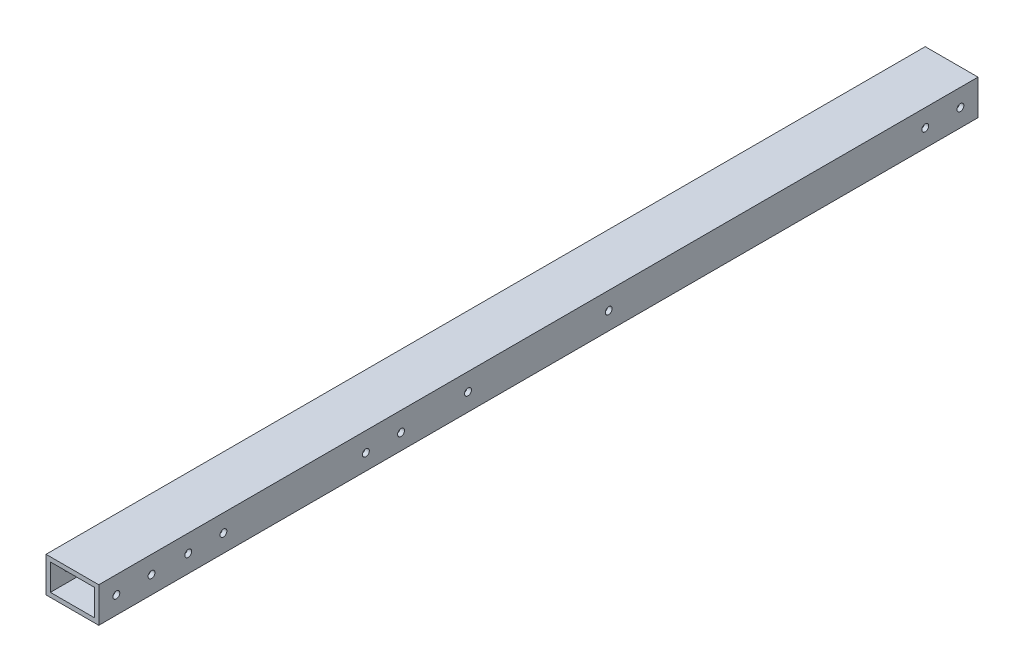
ISO-10303-21;
HEADER;
FILE_DESCRIPTION(('STEP AP214'),'2;1');
FILE_NAME('part.step','',(''),(''),'','','');
FILE_SCHEMA(('AUTOMOTIVE_DESIGN { 1 0 10303 214 1 1 1 1 }'));
ENDSEC;
DATA;
#1=APPLICATION_CONTEXT('core data for automotive mechanical design processes');
#2=APPLICATION_PROTOCOL_DEFINITION('international standard','automotive_design',2000,#1);
#3=PRODUCT_CONTEXT('',#1,'mechanical');
#4=PRODUCT('Part','Part','',(#3));
#5=PRODUCT_RELATED_PRODUCT_CATEGORY('part','',(#4));
#6=PRODUCT_DEFINITION_FORMATION('','',#4);
#7=PRODUCT_DEFINITION_CONTEXT('part definition',#1,'design');
#8=PRODUCT_DEFINITION('design','',#6,#7);
#9=PRODUCT_DEFINITION_SHAPE('','',#8);
#10=(LENGTH_UNIT() NAMED_UNIT(*) SI_UNIT(.MILLI.,.METRE.));
#11=(NAMED_UNIT(*) PLANE_ANGLE_UNIT() SI_UNIT($,.RADIAN.));
#12=(NAMED_UNIT(*) SI_UNIT($,.STERADIAN.) SOLID_ANGLE_UNIT());
#13=UNCERTAINTY_MEASURE_WITH_UNIT(LENGTH_MEASURE(1.E-05),#10,'distance_accuracy_value','');
#14=(GEOMETRIC_REPRESENTATION_CONTEXT(3) GLOBAL_UNCERTAINTY_ASSIGNED_CONTEXT((#13)) GLOBAL_UNIT_ASSIGNED_CONTEXT((#10,
#11,#12)) REPRESENTATION_CONTEXT('',''));
#15=CARTESIAN_POINT('',(0.,0.,0.));
#16=DIRECTION('',(0.,0.,1.));
#17=DIRECTION('',(1.,0.,0.));
#18=AXIS2_PLACEMENT_3D('',#15,#16,#17);
#19=CARTESIAN_POINT('',(0.,0.,317.499999492));
#20=DIRECTION('',(0.,0.,1.));
#21=DIRECTION('',(1.,0.,0.));
#22=AXIS2_PLACEMENT_3D('',#19,#20,#21);
#23=PLANE('',#22);
#24=DIRECTION('',(0.,-1.,0.));
#25=VECTOR('',#24,1.);
#26=CARTESIAN_POINT('',(-19.05,12.7,317.499999492));
#27=LINE('',#26,#25);
#28=CARTESIAN_POINT('',(-19.05,12.7,317.499999492));
#29=VERTEX_POINT('',#28);
#30=CARTESIAN_POINT('',(-19.05,-12.7,317.499999492));
#31=VERTEX_POINT('',#30);
#32=EDGE_CURVE('E121',#29,#31,#27,.T.);
#33=ORIENTED_EDGE('',*,*,#32,.T.);
#34=DIRECTION('',(1.,0.,0.));
#35=VECTOR('',#34,1.);
#36=CARTESIAN_POINT('',(-19.05,-12.7,317.499999492));
#37=LINE('',#36,#35);
#38=CARTESIAN_POINT('',(19.05,-12.7,317.499999492));
#39=VERTEX_POINT('',#38);
#40=EDGE_CURVE('E186',#31,#39,#37,.T.);
#41=ORIENTED_EDGE('',*,*,#40,.T.);
#42=DIRECTION('',(0.,1.,0.));
#43=VECTOR('',#42,1.);
#44=CARTESIAN_POINT('',(19.05,-12.7,317.499999492));
#45=LINE('',#44,#43);
#46=CARTESIAN_POINT('',(19.05,12.7,317.499999492));
#47=VERTEX_POINT('',#46);
#48=EDGE_CURVE('E189',#39,#47,#45,.T.);
#49=ORIENTED_EDGE('',*,*,#48,.T.);
#50=DIRECTION('',(-1.,0.,0.));
#51=VECTOR('',#50,1.);
#52=CARTESIAN_POINT('',(19.05,12.7,317.499999492));
#53=LINE('',#52,#51);
#54=EDGE_CURVE('E67',#47,#29,#53,.T.);
#55=ORIENTED_EDGE('',*,*,#54,.T.);
#56=EDGE_LOOP('',(#33,#41,#49,#55));
#57=FACE_BOUND('',#56,.T.);
#58=DIRECTION('',(1.,0.,0.));
#59=VECTOR('',#58,1.);
#60=CARTESIAN_POINT('',(-15.875,-9.525,317.499999492));
#61=LINE('',#60,#59);
#62=CARTESIAN_POINT('',(-15.875,-9.525,317.499999492));
#63=VERTEX_POINT('',#62);
#64=CARTESIAN_POINT('',(15.875,-9.525,317.499999492));
#65=VERTEX_POINT('',#64);
#66=EDGE_CURVE('E169',#63,#65,#61,.T.);
#67=ORIENTED_EDGE('',*,*,#66,.F.);
#68=DIRECTION('',(0.,-1.,0.));
#69=VECTOR('',#68,1.);
#70=CARTESIAN_POINT('',(-15.875,9.525,317.499999492));
#71=LINE('',#70,#69);
#72=CARTESIAN_POINT('',(-15.875,9.525,317.499999492));
#73=VERTEX_POINT('',#72);
#74=EDGE_CURVE('E117',#73,#63,#71,.T.);
#75=ORIENTED_EDGE('',*,*,#74,.F.);
#76=DIRECTION('',(-1.,0.,0.));
#77=VECTOR('',#76,1.);
#78=CARTESIAN_POINT('',(15.875,9.525,317.499999492));
#79=LINE('',#78,#77);
#80=CARTESIAN_POINT('',(15.875,9.525,317.499999492));
#81=VERTEX_POINT('',#80);
#82=EDGE_CURVE('E175',#81,#73,#79,.T.);
#83=ORIENTED_EDGE('',*,*,#82,.F.);
#84=DIRECTION('',(0.,1.,0.));
#85=VECTOR('',#84,1.);
#86=CARTESIAN_POINT('',(15.875,-9.525,317.499999492));
#87=LINE('',#86,#85);
#88=EDGE_CURVE('E172',#65,#81,#87,.T.);
#89=ORIENTED_EDGE('',*,*,#88,.F.);
#90=EDGE_LOOP('',(#67,#75,#83,#89));
#91=FACE_BOUND('',#90,.T.);
#92=ADVANCED_FACE('F41',(#57,#91),#23,.T.);
#93=CARTESIAN_POINT('',(-19.05,12.7,317.499999492));
#94=DIRECTION('',(1.,0.,0.));
#95=DIRECTION('',(0.,0.,-1.));
#96=AXIS2_PLACEMENT_3D('',#93,#94,#95);
#97=PLANE('',#96);
#98=CARTESIAN_POINT('',(-19.05,0.,-50.8));
#99=DIRECTION('',(-1.,0.,0.));
#100=DIRECTION('',(0.,0.,1.));
#101=AXIS2_PLACEMENT_3D('',#98,#99,#100);
#102=CIRCLE('',#101,2.48919999999999);
#103=CARTESIAN_POINT('',(-19.05,0.,-48.3108));
#104=VERTEX_POINT('',#103);
#105=EDGE_CURVE('E439',#104,#104,#102,.T.);
#106=ORIENTED_EDGE('',*,*,#105,.F.);
#107=EDGE_LOOP('',(#106));
#108=FACE_BOUND('',#107,.T.);
#109=CARTESIAN_POINT('',(-19.05,0.,50.8));
#110=DIRECTION('',(-1.,0.,0.));
#111=DIRECTION('',(0.,0.,1.));
#112=AXIS2_PLACEMENT_3D('',#109,#110,#111);
#113=CIRCLE('',#112,2.48919999999999);
#114=CARTESIAN_POINT('',(-19.05,0.,53.2892));
#115=VERTEX_POINT('',#114);
#116=EDGE_CURVE('E445',#115,#115,#113,.T.);
#117=ORIENTED_EDGE('',*,*,#116,.F.);
#118=EDGE_LOOP('',(#117));
#119=FACE_BOUND('',#118,.T.);
#120=CARTESIAN_POINT('',(-19.05,-1.23159570805203,124.587000508));
#121=DIRECTION('',(1.,0.,0.));
#122=DIRECTION('',(0.,0.,-1.));
#123=AXIS2_PLACEMENT_3D('',#120,#121,#122);
#124=CIRCLE('',#123,2.48919999999999);
#125=CARTESIAN_POINT('',(-19.05,-1.23159570805203,122.097800508));
#126=VERTEX_POINT('',#125);
#127=EDGE_CURVE('E458',#126,#126,#124,.T.);
#128=ORIENTED_EDGE('',*,*,#127,.T.);
#129=EDGE_LOOP('',(#128));
#130=FACE_BOUND('',#129,.T.);
#131=CARTESIAN_POINT('',(-19.05,-1.23159570805206,99.1870005080002));
#132=DIRECTION('',(1.,0.,0.));
#133=DIRECTION('',(0.,0.,-1.));
#134=AXIS2_PLACEMENT_3D('',#131,#132,#133);
#135=CIRCLE('',#134,2.48919999999999);
#136=CARTESIAN_POINT('',(-19.05,-1.23159570805206,96.6978005080002));
#137=VERTEX_POINT('',#136);
#138=EDGE_CURVE('E232',#137,#137,#135,.T.);
#139=ORIENTED_EDGE('',*,*,#138,.T.);
#140=EDGE_LOOP('',(#139));
#141=FACE_BOUND('',#140,.T.);
#142=CARTESIAN_POINT('',(-19.05,-5.03419628032631E-07,252.857000508));
#143=DIRECTION('',(1.,0.,0.));
#144=DIRECTION('',(0.,0.,-1.));
#145=AXIS2_PLACEMENT_3D('',#142,#143,#144);
#146=CIRCLE('',#145,2.48919999999999);
#147=CARTESIAN_POINT('',(-19.05,-5.03419628032631E-07,250.367800508));
#148=VERTEX_POINT('',#147);
#149=EDGE_CURVE('E228',#148,#148,#146,.T.);
#150=ORIENTED_EDGE('',*,*,#149,.T.);
#151=EDGE_LOOP('',(#150));
#152=FACE_BOUND('',#151,.T.);
#153=CARTESIAN_POINT('',(-19.05,-5.03419605056415E-07,227.457000508));
#154=DIRECTION('',(1.,0.,0.));
#155=DIRECTION('',(0.,0.,-1.));
#156=AXIS2_PLACEMENT_3D('',#153,#154,#155);
#157=CIRCLE('',#156,2.48919999999999);
#158=CARTESIAN_POINT('',(-19.05,-5.03419605056415E-07,224.967800508));
#159=VERTEX_POINT('',#158);
#160=EDGE_CURVE('E224',#159,#159,#157,.T.);
#161=ORIENTED_EDGE('',*,*,#160,.T.);
#162=EDGE_LOOP('',(#161));
#163=FACE_BOUND('',#162,.T.);
#164=CARTESIAN_POINT('',(-19.05,0.,-304.799999492));
#165=DIRECTION('',(-1.,0.,0.));
#166=DIRECTION('',(0.,0.,1.));
#167=AXIS2_PLACEMENT_3D('',#164,#165,#166);
#168=CIRCLE('',#167,2.4892);
#169=CARTESIAN_POINT('',(-19.05,0.,-302.310799492));
#170=VERTEX_POINT('',#169);
#171=EDGE_CURVE('E261',#170,#170,#168,.T.);
#172=ORIENTED_EDGE('',*,*,#171,.F.);
#173=EDGE_LOOP('',(#172));
#174=FACE_BOUND('',#173,.T.);
#175=CARTESIAN_POINT('',(-19.05,0.,-279.399999492));
#176=DIRECTION('',(-1.,0.,0.));
#177=DIRECTION('',(0.,0.,1.));
#178=AXIS2_PLACEMENT_3D('',#175,#176,#177);
#179=CIRCLE('',#178,2.4892);
#180=CARTESIAN_POINT('',(-19.05,0.,-276.910799492));
#181=VERTEX_POINT('',#180);
#182=EDGE_CURVE('E268',#181,#181,#179,.T.);
#183=ORIENTED_EDGE('',*,*,#182,.F.);
#184=EDGE_LOOP('',(#183));
#185=FACE_BOUND('',#184,.T.);
#186=CARTESIAN_POINT('',(-19.05,0.,279.400000508));
#187=DIRECTION('',(-1.,0.,0.));
#188=DIRECTION('',(0.,0.,1.));
#189=AXIS2_PLACEMENT_3D('',#186,#187,#188);
#190=CIRCLE('',#189,2.4892);
#191=CARTESIAN_POINT('',(-19.05,0.,281.889200508));
#192=VERTEX_POINT('',#191);
#193=EDGE_CURVE('E275',#192,#192,#190,.T.);
#194=ORIENTED_EDGE('',*,*,#193,.F.);
#195=EDGE_LOOP('',(#194));
#196=FACE_BOUND('',#195,.T.);
#197=CARTESIAN_POINT('',(-19.05,0.,304.800000508));
#198=DIRECTION('',(-1.,0.,0.));
#199=DIRECTION('',(0.,0.,1.));
#200=AXIS2_PLACEMENT_3D('',#197,#198,#199);
#201=CIRCLE('',#200,2.4892);
#202=CARTESIAN_POINT('',(-19.05,0.,307.289200508));
#203=VERTEX_POINT('',#202);
#204=EDGE_CURVE('E282',#203,#203,#201,.T.);
#205=ORIENTED_EDGE('',*,*,#204,.F.);
#206=EDGE_LOOP('',(#205));
#207=FACE_BOUND('',#206,.T.);
#208=DIRECTION('',(0.,0.,-1.));
#209=VECTOR('',#208,1.);
#210=CARTESIAN_POINT('',(-19.05,12.7,317.499999492));
#211=LINE('',#210,#209);
#212=CARTESIAN_POINT('',(-19.05,12.7,-317.499999492));
#213=VERTEX_POINT('',#212);
#214=EDGE_CURVE('E194',#29,#213,#211,.T.);
#215=ORIENTED_EDGE('',*,*,#214,.T.);
#216=DIRECTION('',(0.,-1.,0.));
#217=VECTOR('',#216,1.);
#218=CARTESIAN_POINT('',(-19.05,12.7,-317.499999492));
#219=LINE('',#218,#217);
#220=CARTESIAN_POINT('',(-19.05,-12.7,-317.499999492));
#221=VERTEX_POINT('',#220);
#222=EDGE_CURVE('E151',#213,#221,#219,.T.);
#223=ORIENTED_EDGE('',*,*,#222,.T.);
#224=DIRECTION('',(0.,0.,-1.));
#225=VECTOR('',#224,1.);
#226=CARTESIAN_POINT('',(-19.05,-12.7,317.499999492));
#227=LINE('',#226,#225);
#228=EDGE_CURVE('E11',#31,#221,#227,.T.);
#229=ORIENTED_EDGE('',*,*,#228,.F.);
#230=ORIENTED_EDGE('',*,*,#32,.F.);
#231=EDGE_LOOP('',(#215,#223,#229,#230));
#232=FACE_BOUND('',#231,.T.);
#233=ADVANCED_FACE('F43',(#108,#119,#130,#141,#152,#163,#174,#185,#196,#207,#232),#97,.F.);
#234=CARTESIAN_POINT('',(-19.05,-12.7,317.499999492));
#235=DIRECTION('',(0.,1.,0.));
#236=DIRECTION('',(0.,0.,1.));
#237=AXIS2_PLACEMENT_3D('',#234,#235,#236);
#238=PLANE('',#237);
#239=ORIENTED_EDGE('',*,*,#228,.T.);
#240=DIRECTION('',(1.,0.,0.));
#241=VECTOR('',#240,1.);
#242=CARTESIAN_POINT('',(-19.05,-12.7,-317.499999492));
#243=LINE('',#242,#241);
#244=CARTESIAN_POINT('',(19.05,-12.7,-317.499999492));
#245=VERTEX_POINT('',#244);
#246=EDGE_CURVE('E155',#221,#245,#243,.T.);
#247=ORIENTED_EDGE('',*,*,#246,.T.);
#248=DIRECTION('',(0.,0.,-1.));
#249=VECTOR('',#248,1.);
#250=CARTESIAN_POINT('',(19.05,-12.7,317.499999492));
#251=LINE('',#250,#249);
#252=EDGE_CURVE('E51',#39,#245,#251,.T.);
#253=ORIENTED_EDGE('',*,*,#252,.F.);
#254=ORIENTED_EDGE('',*,*,#40,.F.);
#255=EDGE_LOOP('',(#239,#247,#253,#254));
#256=FACE_BOUND('',#255,.T.);
#257=ADVANCED_FACE('F310',(#256),#238,.F.);
#258=CARTESIAN_POINT('',(19.05,-12.7,317.499999492));
#259=DIRECTION('',(-1.,0.,0.));
#260=DIRECTION('',(0.,-1.,0.));
#261=AXIS2_PLACEMENT_3D('',#258,#259,#260);
#262=PLANE('',#261);
#263=CARTESIAN_POINT('',(19.05,0.,-50.8));
#264=DIRECTION('',(-1.,0.,0.));
#265=DIRECTION('',(0.,0.,1.));
#266=AXIS2_PLACEMENT_3D('',#263,#264,#265);
#267=CIRCLE('',#266,2.4892);
#268=CARTESIAN_POINT('',(19.05,0.,-48.3108));
#269=VERTEX_POINT('',#268);
#270=EDGE_CURVE('E438',#269,#269,#267,.T.);
#271=ORIENTED_EDGE('',*,*,#270,.T.);
#272=EDGE_LOOP('',(#271));
#273=FACE_BOUND('',#272,.T.);
#274=CARTESIAN_POINT('',(19.05,0.,50.8));
#275=DIRECTION('',(-1.,0.,0.));
#276=DIRECTION('',(0.,0.,1.));
#277=AXIS2_PLACEMENT_3D('',#274,#275,#276);
#278=CIRCLE('',#277,2.4892);
#279=CARTESIAN_POINT('',(19.05,0.,53.2892));
#280=VERTEX_POINT('',#279);
#281=EDGE_CURVE('E448',#280,#280,#278,.T.);
#282=ORIENTED_EDGE('',*,*,#281,.T.);
#283=EDGE_LOOP('',(#282));
#284=FACE_BOUND('',#283,.T.);
#285=CARTESIAN_POINT('',(19.05,-1.23159570805203,124.587000508));
#286=DIRECTION('',(1.,0.,0.));
#287=DIRECTION('',(0.,0.,-1.));
#288=AXIS2_PLACEMENT_3D('',#285,#286,#287);
#289=CIRCLE('',#288,2.4892);
#290=CARTESIAN_POINT('',(19.05,-1.23159570805203,122.097800508));
#291=VERTEX_POINT('',#290);
#292=EDGE_CURVE('E455',#291,#291,#289,.T.);
#293=ORIENTED_EDGE('',*,*,#292,.F.);
#294=EDGE_LOOP('',(#293));
#295=FACE_BOUND('',#294,.T.);
#296=CARTESIAN_POINT('',(19.05,-1.23159570805206,99.1870005080002));
#297=DIRECTION('',(1.,0.,0.));
#298=DIRECTION('',(0.,0.,-1.));
#299=AXIS2_PLACEMENT_3D('',#296,#297,#298);
#300=CIRCLE('',#299,2.4892);
#301=CARTESIAN_POINT('',(19.05,-1.23159570805206,96.6978005080002));
#302=VERTEX_POINT('',#301);
#303=EDGE_CURVE('E239',#302,#302,#300,.T.);
#304=ORIENTED_EDGE('',*,*,#303,.F.);
#305=EDGE_LOOP('',(#304));
#306=FACE_BOUND('',#305,.T.);
#307=CARTESIAN_POINT('',(19.05,-5.03419628032631E-07,252.857000508));
#308=DIRECTION('',(1.,0.,0.));
#309=DIRECTION('',(0.,0.,-1.));
#310=AXIS2_PLACEMENT_3D('',#307,#308,#309);
#311=CIRCLE('',#310,2.4892);
#312=CARTESIAN_POINT('',(19.05,-5.03419628032631E-07,250.367800508));
#313=VERTEX_POINT('',#312);
#314=EDGE_CURVE('E236',#313,#313,#311,.T.);
#315=ORIENTED_EDGE('',*,*,#314,.F.);
#316=EDGE_LOOP('',(#315));
#317=FACE_BOUND('',#316,.T.);
#318=CARTESIAN_POINT('',(19.05,-5.03419605056415E-07,227.457000508));
#319=DIRECTION('',(1.,0.,0.));
#320=DIRECTION('',(0.,0.,-1.));
#321=AXIS2_PLACEMENT_3D('',#318,#319,#320);
#322=CIRCLE('',#321,2.4892);
#323=CARTESIAN_POINT('',(19.05,-5.03419605056415E-07,224.967800508));
#324=VERTEX_POINT('',#323);
#325=EDGE_CURVE('E254',#324,#324,#322,.T.);
#326=ORIENTED_EDGE('',*,*,#325,.F.);
#327=EDGE_LOOP('',(#326));
#328=FACE_BOUND('',#327,.T.);
#329=CARTESIAN_POINT('',(19.05,0.,-304.799999492));
#330=DIRECTION('',(-1.,0.,0.));
#331=DIRECTION('',(0.,0.,1.));
#332=AXIS2_PLACEMENT_3D('',#329,#330,#331);
#333=CIRCLE('',#332,2.48919999999999);
#334=CARTESIAN_POINT('',(19.05,0.,-302.310799492));
#335=VERTEX_POINT('',#334);
#336=EDGE_CURVE('E219',#335,#335,#333,.T.);
#337=ORIENTED_EDGE('',*,*,#336,.T.);
#338=EDGE_LOOP('',(#337));
#339=FACE_BOUND('',#338,.T.);
#340=CARTESIAN_POINT('',(19.05,0.,-279.399999492));
#341=DIRECTION('',(-1.,0.,0.));
#342=DIRECTION('',(0.,0.,1.));
#343=AXIS2_PLACEMENT_3D('',#340,#341,#342);
#344=CIRCLE('',#343,2.48919999999999);
#345=CARTESIAN_POINT('',(19.05,0.,-276.910799492));
#346=VERTEX_POINT('',#345);
#347=EDGE_CURVE('E214',#346,#346,#344,.T.);
#348=ORIENTED_EDGE('',*,*,#347,.T.);
#349=EDGE_LOOP('',(#348));
#350=FACE_BOUND('',#349,.T.);
#351=CARTESIAN_POINT('',(19.05,0.,279.400000508));
#352=DIRECTION('',(-1.,0.,0.));
#353=DIRECTION('',(0.,0.,1.));
#354=AXIS2_PLACEMENT_3D('',#351,#352,#353);
#355=CIRCLE('',#354,2.48919999999999);
#356=CARTESIAN_POINT('',(19.05,0.,281.889200508));
#357=VERTEX_POINT('',#356);
#358=EDGE_CURVE('E209',#357,#357,#355,.T.);
#359=ORIENTED_EDGE('',*,*,#358,.T.);
#360=EDGE_LOOP('',(#359));
#361=FACE_BOUND('',#360,.T.);
#362=CARTESIAN_POINT('',(19.05,0.,304.800000508));
#363=DIRECTION('',(-1.,0.,0.));
#364=DIRECTION('',(0.,0.,1.));
#365=AXIS2_PLACEMENT_3D('',#362,#363,#364);
#366=CIRCLE('',#365,2.48919999999999);
#367=CARTESIAN_POINT('',(19.05,0.,307.289200508));
#368=VERTEX_POINT('',#367);
#369=EDGE_CURVE('E204',#368,#368,#366,.T.);
#370=ORIENTED_EDGE('',*,*,#369,.T.);
#371=EDGE_LOOP('',(#370));
#372=FACE_BOUND('',#371,.T.);
#373=ORIENTED_EDGE('',*,*,#252,.T.);
#374=DIRECTION('',(0.,1.,0.));
#375=VECTOR('',#374,1.);
#376=CARTESIAN_POINT('',(19.05,-12.7,-317.499999492));
#377=LINE('',#376,#375);
#378=CARTESIAN_POINT('',(19.05,12.7,-317.499999492));
#379=VERTEX_POINT('',#378);
#380=EDGE_CURVE('E159',#245,#379,#377,.T.);
#381=ORIENTED_EDGE('',*,*,#380,.T.);
#382=DIRECTION('',(0.,0.,-1.));
#383=VECTOR('',#382,1.);
#384=CARTESIAN_POINT('',(19.05,12.7,317.499999492));
#385=LINE('',#384,#383);
#386=EDGE_CURVE('E197',#47,#379,#385,.T.);
#387=ORIENTED_EDGE('',*,*,#386,.F.);
#388=ORIENTED_EDGE('',*,*,#48,.F.);
#389=EDGE_LOOP('',(#373,#381,#387,#388));
#390=FACE_BOUND('',#389,.T.);
#391=ADVANCED_FACE('F287',(#273,#284,#295,#306,#317,#328,#339,#350,#361,#372,#390),#262,.F.);
#392=CARTESIAN_POINT('',(19.05,12.7,317.499999492));
#393=DIRECTION('',(0.,-1.,0.));
#394=DIRECTION('',(0.,0.,-1.));
#395=AXIS2_PLACEMENT_3D('',#392,#393,#394);
#396=PLANE('',#395);
#397=ORIENTED_EDGE('',*,*,#386,.T.);
#398=DIRECTION('',(-1.,0.,0.));
#399=VECTOR('',#398,1.);
#400=CARTESIAN_POINT('',(19.05,12.7,-317.499999492));
#401=LINE('',#400,#399);
#402=EDGE_CURVE('E163',#379,#213,#401,.T.);
#403=ORIENTED_EDGE('',*,*,#402,.T.);
#404=ORIENTED_EDGE('',*,*,#214,.F.);
#405=ORIENTED_EDGE('',*,*,#54,.F.);
#406=EDGE_LOOP('',(#397,#403,#404,#405));
#407=FACE_BOUND('',#406,.T.);
#408=ADVANCED_FACE('F316',(#407),#396,.F.);
#409=CARTESIAN_POINT('',(-15.875,9.525,317.499999492));
#410=DIRECTION('',(1.,0.,0.));
#411=DIRECTION('',(0.,1.,0.));
#412=AXIS2_PLACEMENT_3D('',#409,#410,#411);
#413=PLANE('',#412);
#414=CARTESIAN_POINT('',(-15.875,0.,-50.8));
#415=DIRECTION('',(1.,0.,0.));
#416=DIRECTION('',(0.,1.,0.));
#417=AXIS2_PLACEMENT_3D('',#414,#415,#416);
#418=CIRCLE('',#417,2.48919999999999);
#419=CARTESIAN_POINT('',(-15.875,2.48919999999999,-50.8));
#420=VERTEX_POINT('',#419);
#421=EDGE_CURVE('E356',#420,#420,#418,.T.);
#422=ORIENTED_EDGE('',*,*,#421,.F.);
#423=EDGE_LOOP('',(#422));
#424=FACE_BOUND('',#423,.T.);
#425=CARTESIAN_POINT('',(-15.875,0.,50.8));
#426=DIRECTION('',(1.,0.,0.));
#427=DIRECTION('',(0.,1.,0.));
#428=AXIS2_PLACEMENT_3D('',#425,#426,#427);
#429=CIRCLE('',#428,2.48919999999999);
#430=CARTESIAN_POINT('',(-15.875,2.48919999999999,50.8));
#431=VERTEX_POINT('',#430);
#432=EDGE_CURVE('E360',#431,#431,#429,.T.);
#433=ORIENTED_EDGE('',*,*,#432,.F.);
#434=EDGE_LOOP('',(#433));
#435=FACE_BOUND('',#434,.T.);
#436=CARTESIAN_POINT('',(-15.875,-1.23159570805203,124.587000508));
#437=DIRECTION('',(1.,0.,0.));
#438=DIRECTION('',(0.,1.,0.));
#439=AXIS2_PLACEMENT_3D('',#436,#437,#438);
#440=CIRCLE('',#439,2.48919999999999);
#441=CARTESIAN_POINT('',(-15.875,1.25760429194796,124.587000508));
#442=VERTEX_POINT('',#441);
#443=EDGE_CURVE('E364',#442,#442,#440,.T.);
#444=ORIENTED_EDGE('',*,*,#443,.F.);
#445=EDGE_LOOP('',(#444));
#446=FACE_BOUND('',#445,.T.);
#447=CARTESIAN_POINT('',(-15.875,-1.23159570805206,99.1870005080002));
#448=DIRECTION('',(1.,0.,0.));
#449=DIRECTION('',(0.,1.,0.));
#450=AXIS2_PLACEMENT_3D('',#447,#448,#449);
#451=CIRCLE('',#450,2.48919999999999);
#452=CARTESIAN_POINT('',(-15.875,1.25760429194793,99.1870005080002));
#453=VERTEX_POINT('',#452);
#454=EDGE_CURVE('E231',#453,#453,#451,.T.);
#455=ORIENTED_EDGE('',*,*,#454,.F.);
#456=EDGE_LOOP('',(#455));
#457=FACE_BOUND('',#456,.T.);
#458=CARTESIAN_POINT('',(-15.875,-5.03419628032631E-07,252.857000508));
#459=DIRECTION('',(1.,0.,0.));
#460=DIRECTION('',(0.,1.,0.));
#461=AXIS2_PLACEMENT_3D('',#458,#459,#460);
#462=CIRCLE('',#461,2.48919999999999);
#463=CARTESIAN_POINT('',(-15.875,2.48919949658037,252.857000508));
#464=VERTEX_POINT('',#463);
#465=EDGE_CURVE('E225',#464,#464,#462,.T.);
#466=ORIENTED_EDGE('',*,*,#465,.F.);
#467=EDGE_LOOP('',(#466));
#468=FACE_BOUND('',#467,.T.);
#469=CARTESIAN_POINT('',(-15.875,-5.03419605056415E-07,227.457000508));
#470=DIRECTION('',(1.,0.,0.));
#471=DIRECTION('',(0.,1.,0.));
#472=AXIS2_PLACEMENT_3D('',#469,#470,#471);
#473=CIRCLE('',#472,2.48919999999999);
#474=CARTESIAN_POINT('',(-15.875,2.48919949658039,227.457000508));
#475=VERTEX_POINT('',#474);
#476=EDGE_CURVE('E220',#475,#475,#473,.T.);
#477=ORIENTED_EDGE('',*,*,#476,.F.);
#478=EDGE_LOOP('',(#477));
#479=FACE_BOUND('',#478,.T.);
#480=CARTESIAN_POINT('',(-15.875,0.,-304.799999492));
#481=DIRECTION('',(1.,0.,0.));
#482=DIRECTION('',(0.,1.,0.));
#483=AXIS2_PLACEMENT_3D('',#480,#481,#482);
#484=CIRCLE('',#483,2.48919999999999);
#485=CARTESIAN_POINT('',(-15.875,2.48919999999999,-304.799999492));
#486=VERTEX_POINT('',#485);
#487=EDGE_CURVE('E218',#486,#486,#484,.T.);
#488=ORIENTED_EDGE('',*,*,#487,.F.);
#489=EDGE_LOOP('',(#488));
#490=FACE_BOUND('',#489,.T.);
#491=CARTESIAN_POINT('',(-15.875,0.,-279.399999492));
#492=DIRECTION('',(1.,0.,0.));
#493=DIRECTION('',(0.,1.,0.));
#494=AXIS2_PLACEMENT_3D('',#491,#492,#493);
#495=CIRCLE('',#494,2.48919999999999);
#496=CARTESIAN_POINT('',(-15.875,2.48919999999992,-279.399999492));
#497=VERTEX_POINT('',#496);
#498=EDGE_CURVE('E213',#497,#497,#495,.T.);
#499=ORIENTED_EDGE('',*,*,#498,.F.);
#500=EDGE_LOOP('',(#499));
#501=FACE_BOUND('',#500,.T.);
#502=CARTESIAN_POINT('',(-15.875,0.,279.400000508));
#503=DIRECTION('',(1.,0.,0.));
#504=DIRECTION('',(0.,1.,0.));
#505=AXIS2_PLACEMENT_3D('',#502,#503,#504);
#506=CIRCLE('',#505,2.48919999999999);
#507=CARTESIAN_POINT('',(-15.875,2.48919999999999,279.400000508));
#508=VERTEX_POINT('',#507);
#509=EDGE_CURVE('E208',#508,#508,#506,.T.);
#510=ORIENTED_EDGE('',*,*,#509,.F.);
#511=EDGE_LOOP('',(#510));
#512=FACE_BOUND('',#511,.T.);
#513=CARTESIAN_POINT('',(-15.875,0.,304.800000508));
#514=DIRECTION('',(1.,0.,0.));
#515=DIRECTION('',(0.,1.,0.));
#516=AXIS2_PLACEMENT_3D('',#513,#514,#515);
#517=CIRCLE('',#516,2.48919999999999);
#518=CARTESIAN_POINT('',(-15.875,2.48919999999999,304.800000508));
#519=VERTEX_POINT('',#518);
#520=EDGE_CURVE('E143',#519,#519,#517,.T.);
#521=ORIENTED_EDGE('',*,*,#520,.F.);
#522=EDGE_LOOP('',(#521));
#523=FACE_BOUND('',#522,.T.);
#524=DIRECTION('',(0.,0.,-1.));
#525=VECTOR('',#524,1.);
#526=CARTESIAN_POINT('',(-15.875,-9.525,317.499999492));
#527=LINE('',#526,#525);
#528=CARTESIAN_POINT('',(-15.875,-9.525,-317.499999492));
#529=VERTEX_POINT('',#528);
#530=EDGE_CURVE('E109',#63,#529,#527,.T.);
#531=ORIENTED_EDGE('',*,*,#530,.T.);
#532=DIRECTION('',(0.,-1.,0.));
#533=VECTOR('',#532,1.);
#534=CARTESIAN_POINT('',(-15.875,9.525,-317.499999492));
#535=LINE('',#534,#533);
#536=CARTESIAN_POINT('',(-15.875,9.525,-317.499999492));
#537=VERTEX_POINT('',#536);
#538=EDGE_CURVE('E114',#537,#529,#535,.T.);
#539=ORIENTED_EDGE('',*,*,#538,.F.);
#540=DIRECTION('',(0.,0.,-1.));
#541=VECTOR('',#540,1.);
#542=CARTESIAN_POINT('',(-15.875,9.525,317.499999492));
#543=LINE('',#542,#541);
#544=EDGE_CURVE('E178',#73,#537,#543,.T.);
#545=ORIENTED_EDGE('',*,*,#544,.F.);
#546=ORIENTED_EDGE('',*,*,#74,.T.);
#547=EDGE_LOOP('',(#531,#539,#545,#546));
#548=FACE_BOUND('',#547,.T.);
#549=ADVANCED_FACE('F111',(#424,#435,#446,#457,#468,#479,#490,#501,#512,#523,#548),#413,.T.);
#550=CARTESIAN_POINT('',(-15.875,-9.525,317.499999492));
#551=DIRECTION('',(0.,1.,0.));
#552=DIRECTION('',(0.,0.,1.));
#553=AXIS2_PLACEMENT_3D('',#550,#551,#552);
#554=PLANE('',#553);
#555=DIRECTION('',(0.,0.,-1.));
#556=VECTOR('',#555,1.);
#557=CARTESIAN_POINT('',(15.875,-9.525,317.499999492));
#558=LINE('',#557,#556);
#559=CARTESIAN_POINT('',(15.875,-9.525,-317.499999492));
#560=VERTEX_POINT('',#559);
#561=EDGE_CURVE('E122',#65,#560,#558,.T.);
#562=ORIENTED_EDGE('',*,*,#561,.T.);
#563=DIRECTION('',(1.,0.,0.));
#564=VECTOR('',#563,1.);
#565=CARTESIAN_POINT('',(-15.875,-9.525,-317.499999492));
#566=LINE('',#565,#564);
#567=EDGE_CURVE('E125',#529,#560,#566,.T.);
#568=ORIENTED_EDGE('',*,*,#567,.F.);
#569=ORIENTED_EDGE('',*,*,#530,.F.);
#570=ORIENTED_EDGE('',*,*,#66,.T.);
#571=EDGE_LOOP('',(#562,#568,#569,#570));
#572=FACE_BOUND('',#571,.T.);
#573=ADVANCED_FACE('F126',(#572),#554,.T.);
#574=CARTESIAN_POINT('',(15.875,-9.525,317.499999492));
#575=DIRECTION('',(-1.,0.,0.));
#576=DIRECTION('',(0.,-1.,0.));
#577=AXIS2_PLACEMENT_3D('',#574,#575,#576);
#578=PLANE('',#577);
#579=CARTESIAN_POINT('',(15.875,0.,-50.8));
#580=DIRECTION('',(-1.,0.,0.));
#581=DIRECTION('',(0.,-1.,0.));
#582=AXIS2_PLACEMENT_3D('',#579,#580,#581);
#583=CIRCLE('',#582,2.48919999999999);
#584=CARTESIAN_POINT('',(15.875,-2.4892,-50.8));
#585=VERTEX_POINT('',#584);
#586=EDGE_CURVE('E45',#585,#585,#583,.T.);
#587=ORIENTED_EDGE('',*,*,#586,.F.);
#588=EDGE_LOOP('',(#587));
#589=FACE_BOUND('',#588,.T.);
#590=CARTESIAN_POINT('',(15.875,0.,50.8));
#591=DIRECTION('',(-1.,0.,0.));
#592=DIRECTION('',(0.,-1.,0.));
#593=AXIS2_PLACEMENT_3D('',#590,#591,#592);
#594=CIRCLE('',#593,2.48919999999999);
#595=CARTESIAN_POINT('',(15.875,-2.48919999999999,50.8));
#596=VERTEX_POINT('',#595);
#597=EDGE_CURVE('E452',#596,#596,#594,.T.);
#598=ORIENTED_EDGE('',*,*,#597,.F.);
#599=EDGE_LOOP('',(#598));
#600=FACE_BOUND('',#599,.T.);
#601=CARTESIAN_POINT('',(15.875,-1.23159570805203,124.587000508));
#602=DIRECTION('',(-1.,0.,0.));
#603=DIRECTION('',(0.,-1.,0.));
#604=AXIS2_PLACEMENT_3D('',#601,#602,#603);
#605=CIRCLE('',#604,2.48919999999999);
#606=CARTESIAN_POINT('',(15.875,-3.72079570805203,124.587000508));
#607=VERTEX_POINT('',#606);
#608=EDGE_CURVE('E244',#607,#607,#605,.T.);
#609=ORIENTED_EDGE('',*,*,#608,.F.);
#610=EDGE_LOOP('',(#609));
#611=FACE_BOUND('',#610,.T.);
#612=CARTESIAN_POINT('',(15.875,-1.23159570805206,99.1870005080002));
#613=DIRECTION('',(-1.,0.,0.));
#614=DIRECTION('',(0.,-1.,0.));
#615=AXIS2_PLACEMENT_3D('',#612,#613,#614);
#616=CIRCLE('',#615,2.48919999999999);
#617=CARTESIAN_POINT('',(15.875,-3.72079570805205,99.1870005080002));
#618=VERTEX_POINT('',#617);
#619=EDGE_CURVE('E229',#618,#618,#616,.T.);
#620=ORIENTED_EDGE('',*,*,#619,.F.);
#621=EDGE_LOOP('',(#620));
#622=FACE_BOUND('',#621,.T.);
#623=CARTESIAN_POINT('',(15.875,-5.03419628032631E-07,252.857000508));
#624=DIRECTION('',(-1.,0.,0.));
#625=DIRECTION('',(0.,-1.,0.));
#626=AXIS2_PLACEMENT_3D('',#623,#624,#625);
#627=CIRCLE('',#626,2.48919999999999);
#628=CARTESIAN_POINT('',(15.875,-2.48920050341962,252.857000508));
#629=VERTEX_POINT('',#628);
#630=EDGE_CURVE('E227',#629,#629,#627,.T.);
#631=ORIENTED_EDGE('',*,*,#630,.F.);
#632=EDGE_LOOP('',(#631));
#633=FACE_BOUND('',#632,.T.);
#634=CARTESIAN_POINT('',(15.875,-5.03419605056415E-07,227.457000508));
#635=DIRECTION('',(-1.,0.,0.));
#636=DIRECTION('',(0.,-1.,0.));
#637=AXIS2_PLACEMENT_3D('',#634,#635,#636);
#638=CIRCLE('',#637,2.48919999999999);
#639=CARTESIAN_POINT('',(15.875,-2.4892005034196,227.457000508));
#640=VERTEX_POINT('',#639);
#641=EDGE_CURVE('E223',#640,#640,#638,.T.);
#642=ORIENTED_EDGE('',*,*,#641,.F.);
#643=EDGE_LOOP('',(#642));
#644=FACE_BOUND('',#643,.T.);
#645=CARTESIAN_POINT('',(15.875,0.,-304.799999492));
#646=DIRECTION('',(-1.,0.,0.));
#647=DIRECTION('',(0.,-1.,0.));
#648=AXIS2_PLACEMENT_3D('',#645,#646,#647);
#649=CIRCLE('',#648,2.48919999999999);
#650=CARTESIAN_POINT('',(15.875,-2.48919999999999,-304.799999492));
#651=VERTEX_POINT('',#650);
#652=EDGE_CURVE('E215',#651,#651,#649,.T.);
#653=ORIENTED_EDGE('',*,*,#652,.F.);
#654=EDGE_LOOP('',(#653));
#655=FACE_BOUND('',#654,.T.);
#656=CARTESIAN_POINT('',(15.875,0.,-279.399999492));
#657=DIRECTION('',(-1.,0.,0.));
#658=DIRECTION('',(0.,-1.,0.));
#659=AXIS2_PLACEMENT_3D('',#656,#657,#658);
#660=CIRCLE('',#659,2.48919999999999);
#661=CARTESIAN_POINT('',(15.875,-2.48920000000007,-279.399999492));
#662=VERTEX_POINT('',#661);
#663=EDGE_CURVE('E210',#662,#662,#660,.T.);
#664=ORIENTED_EDGE('',*,*,#663,.F.);
#665=EDGE_LOOP('',(#664));
#666=FACE_BOUND('',#665,.T.);
#667=CARTESIAN_POINT('',(15.875,0.,279.400000508));
#668=DIRECTION('',(-1.,0.,0.));
#669=DIRECTION('',(0.,-1.,0.));
#670=AXIS2_PLACEMENT_3D('',#667,#668,#669);
#671=CIRCLE('',#670,2.48919999999999);
#672=CARTESIAN_POINT('',(15.875,-2.4892,279.400000508));
#673=VERTEX_POINT('',#672);
#674=EDGE_CURVE('E205',#673,#673,#671,.T.);
#675=ORIENTED_EDGE('',*,*,#674,.F.);
#676=EDGE_LOOP('',(#675));
#677=FACE_BOUND('',#676,.T.);
#678=CARTESIAN_POINT('',(15.875,0.,304.800000508));
#679=DIRECTION('',(-1.,0.,0.));
#680=DIRECTION('',(0.,-1.,0.));
#681=AXIS2_PLACEMENT_3D('',#678,#679,#680);
#682=CIRCLE('',#681,2.48919999999999);
#683=CARTESIAN_POINT('',(15.875,-2.48919999999999,304.800000508));
#684=VERTEX_POINT('',#683);
#685=EDGE_CURVE('E138',#684,#684,#682,.T.);
#686=ORIENTED_EDGE('',*,*,#685,.F.);
#687=EDGE_LOOP('',(#686));
#688=FACE_BOUND('',#687,.T.);
#689=DIRECTION('',(0.,0.,-1.));
#690=VECTOR('',#689,1.);
#691=CARTESIAN_POINT('',(15.875,9.525,317.499999492));
#692=LINE('',#691,#690);
#693=CARTESIAN_POINT('',(15.875,9.525,-317.499999492));
#694=VERTEX_POINT('',#693);
#695=EDGE_CURVE('E59',#81,#694,#692,.T.);
#696=ORIENTED_EDGE('',*,*,#695,.T.);
#697=DIRECTION('',(0.,1.,0.));
#698=VECTOR('',#697,1.);
#699=CARTESIAN_POINT('',(15.875,-9.525,-317.499999492));
#700=LINE('',#699,#698);
#701=EDGE_CURVE('E132',#560,#694,#700,.T.);
#702=ORIENTED_EDGE('',*,*,#701,.F.);
#703=ORIENTED_EDGE('',*,*,#561,.F.);
#704=ORIENTED_EDGE('',*,*,#88,.T.);
#705=EDGE_LOOP('',(#696,#702,#703,#704));
#706=FACE_BOUND('',#705,.T.);
#707=ADVANCED_FACE('F341',(#589,#600,#611,#622,#633,#644,#655,#666,#677,#688,#706),#578,.T.);
#708=CARTESIAN_POINT('',(15.875,9.525,317.499999492));
#709=DIRECTION('',(0.,-1.,0.));
#710=DIRECTION('',(0.,0.,-1.));
#711=AXIS2_PLACEMENT_3D('',#708,#709,#710);
#712=PLANE('',#711);
#713=ORIENTED_EDGE('',*,*,#544,.T.);
#714=DIRECTION('',(-1.,0.,0.));
#715=VECTOR('',#714,1.);
#716=CARTESIAN_POINT('',(15.875,9.525,-317.499999492));
#717=LINE('',#716,#715);
#718=EDGE_CURVE('E136',#694,#537,#717,.T.);
#719=ORIENTED_EDGE('',*,*,#718,.F.);
#720=ORIENTED_EDGE('',*,*,#695,.F.);
#721=ORIENTED_EDGE('',*,*,#82,.T.);
#722=EDGE_LOOP('',(#713,#719,#720,#721));
#723=FACE_BOUND('',#722,.T.);
#724=ADVANCED_FACE('F337',(#723),#712,.T.);
#725=CARTESIAN_POINT('',(0.,0.,-317.499999492));
#726=DIRECTION('',(0.,0.,1.));
#727=DIRECTION('',(1.,0.,0.));
#728=AXIS2_PLACEMENT_3D('',#725,#726,#727);
#729=PLANE('',#728);
#730=ORIENTED_EDGE('',*,*,#718,.T.);
#731=ORIENTED_EDGE('',*,*,#538,.T.);
#732=ORIENTED_EDGE('',*,*,#567,.T.);
#733=ORIENTED_EDGE('',*,*,#701,.T.);
#734=EDGE_LOOP('',(#730,#731,#732,#733));
#735=FACE_BOUND('',#734,.T.);
#736=ORIENTED_EDGE('',*,*,#222,.F.);
#737=ORIENTED_EDGE('',*,*,#402,.F.);
#738=ORIENTED_EDGE('',*,*,#380,.F.);
#739=ORIENTED_EDGE('',*,*,#246,.F.);
#740=EDGE_LOOP('',(#736,#737,#738,#739));
#741=FACE_BOUND('',#740,.T.);
#742=ADVANCED_FACE('F134',(#735,#741),#729,.F.);
#743=CARTESIAN_POINT('',(-19.05,0.,304.800000508));
#744=DIRECTION('',(-1.,0.,0.));
#745=DIRECTION('',(0.,0.,1.));
#746=AXIS2_PLACEMENT_3D('',#743,#744,#745);
#747=CYLINDRICAL_SURFACE('',#746,2.48919999999999);
#748=ORIENTED_EDGE('',*,*,#520,.T.);
#749=EDGE_LOOP('',(#748));
#750=FACE_BOUND('',#749,.T.);
#751=ORIENTED_EDGE('',*,*,#204,.T.);
#752=EDGE_LOOP('',(#751));
#753=FACE_BOUND('',#752,.T.);
#754=ADVANCED_FACE('F293',(#750,#753),#747,.F.);
#755=ORIENTED_EDGE('',*,*,#685,.T.);
#756=EDGE_LOOP('',(#755));
#757=FACE_BOUND('',#756,.T.);
#758=ORIENTED_EDGE('',*,*,#369,.F.);
#759=EDGE_LOOP('',(#758));
#760=FACE_BOUND('',#759,.T.);
#761=ADVANCED_FACE('F290',(#757,#760),#747,.F.);
#762=CARTESIAN_POINT('',(-19.05,0.,279.400000508));
#763=DIRECTION('',(-1.,0.,0.));
#764=DIRECTION('',(0.,0.,1.));
#765=AXIS2_PLACEMENT_3D('',#762,#763,#764);
#766=CYLINDRICAL_SURFACE('',#765,2.48919999999999);
#767=ORIENTED_EDGE('',*,*,#674,.T.);
#768=EDGE_LOOP('',(#767));
#769=FACE_BOUND('',#768,.T.);
#770=ORIENTED_EDGE('',*,*,#358,.F.);
#771=EDGE_LOOP('',(#770));
#772=FACE_BOUND('',#771,.T.);
#773=ADVANCED_FACE('F292',(#769,#772),#766,.F.);
#774=ORIENTED_EDGE('',*,*,#509,.T.);
#775=EDGE_LOOP('',(#774));
#776=FACE_BOUND('',#775,.T.);
#777=ORIENTED_EDGE('',*,*,#193,.T.);
#778=EDGE_LOOP('',(#777));
#779=FACE_BOUND('',#778,.T.);
#780=ADVANCED_FACE('F300',(#776,#779),#766,.F.);
#781=CARTESIAN_POINT('',(-19.05,0.,-279.399999492));
#782=DIRECTION('',(-1.,0.,0.));
#783=DIRECTION('',(0.,0.,1.));
#784=AXIS2_PLACEMENT_3D('',#781,#782,#783);
#785=CYLINDRICAL_SURFACE('',#784,2.48919999999999);
#786=ORIENTED_EDGE('',*,*,#663,.T.);
#787=EDGE_LOOP('',(#786));
#788=FACE_BOUND('',#787,.T.);
#789=ORIENTED_EDGE('',*,*,#347,.F.);
#790=EDGE_LOOP('',(#789));
#791=FACE_BOUND('',#790,.T.);
#792=ADVANCED_FACE('F384',(#788,#791),#785,.F.);
#793=ORIENTED_EDGE('',*,*,#498,.T.);
#794=EDGE_LOOP('',(#793));
#795=FACE_BOUND('',#794,.T.);
#796=ORIENTED_EDGE('',*,*,#182,.T.);
#797=EDGE_LOOP('',(#796));
#798=FACE_BOUND('',#797,.T.);
#799=ADVANCED_FACE('F390',(#795,#798),#785,.F.);
#800=CARTESIAN_POINT('',(-19.05,0.,-304.799999492));
#801=DIRECTION('',(-1.,0.,0.));
#802=DIRECTION('',(0.,0.,1.));
#803=AXIS2_PLACEMENT_3D('',#800,#801,#802);
#804=CYLINDRICAL_SURFACE('',#803,2.48919999999999);
#805=ORIENTED_EDGE('',*,*,#652,.T.);
#806=EDGE_LOOP('',(#805));
#807=FACE_BOUND('',#806,.T.);
#808=ORIENTED_EDGE('',*,*,#336,.F.);
#809=EDGE_LOOP('',(#808));
#810=FACE_BOUND('',#809,.T.);
#811=ADVANCED_FACE('F394',(#807,#810),#804,.F.);
#812=ORIENTED_EDGE('',*,*,#487,.T.);
#813=EDGE_LOOP('',(#812));
#814=FACE_BOUND('',#813,.T.);
#815=ORIENTED_EDGE('',*,*,#171,.T.);
#816=EDGE_LOOP('',(#815));
#817=FACE_BOUND('',#816,.T.);
#818=ADVANCED_FACE('F397',(#814,#817),#804,.F.);
#819=CARTESIAN_POINT('',(19.05,-5.03419605056415E-07,227.457000508));
#820=DIRECTION('',(1.,0.,0.));
#821=DIRECTION('',(0.,0.,-1.));
#822=AXIS2_PLACEMENT_3D('',#819,#820,#821);
#823=CYLINDRICAL_SURFACE('',#822,2.48919999999999);
#824=ORIENTED_EDGE('',*,*,#476,.T.);
#825=EDGE_LOOP('',(#824));
#826=FACE_BOUND('',#825,.T.);
#827=ORIENTED_EDGE('',*,*,#160,.F.);
#828=EDGE_LOOP('',(#827));
#829=FACE_BOUND('',#828,.T.);
#830=ADVANCED_FACE('F399',(#826,#829),#823,.F.);
#831=ORIENTED_EDGE('',*,*,#641,.T.);
#832=EDGE_LOOP('',(#831));
#833=FACE_BOUND('',#832,.T.);
#834=ORIENTED_EDGE('',*,*,#325,.T.);
#835=EDGE_LOOP('',(#834));
#836=FACE_BOUND('',#835,.T.);
#837=ADVANCED_FACE('F402',(#833,#836),#823,.F.);
#838=CARTESIAN_POINT('',(19.05,-5.03419628032631E-07,252.857000508));
#839=DIRECTION('',(1.,0.,0.));
#840=DIRECTION('',(0.,0.,-1.));
#841=AXIS2_PLACEMENT_3D('',#838,#839,#840);
#842=CYLINDRICAL_SURFACE('',#841,2.48919999999999);
#843=ORIENTED_EDGE('',*,*,#465,.T.);
#844=EDGE_LOOP('',(#843));
#845=FACE_BOUND('',#844,.T.);
#846=ORIENTED_EDGE('',*,*,#149,.F.);
#847=EDGE_LOOP('',(#846));
#848=FACE_BOUND('',#847,.T.);
#849=ADVANCED_FACE('F404',(#845,#848),#842,.F.);
#850=ORIENTED_EDGE('',*,*,#630,.T.);
#851=EDGE_LOOP('',(#850));
#852=FACE_BOUND('',#851,.T.);
#853=ORIENTED_EDGE('',*,*,#314,.T.);
#854=EDGE_LOOP('',(#853));
#855=FACE_BOUND('',#854,.T.);
#856=ADVANCED_FACE('F407',(#852,#855),#842,.F.);
#857=CARTESIAN_POINT('',(19.05,-1.23159570805206,99.1870005080002));
#858=DIRECTION('',(1.,0.,0.));
#859=DIRECTION('',(0.,0.,-1.));
#860=AXIS2_PLACEMENT_3D('',#857,#858,#859);
#861=CYLINDRICAL_SURFACE('',#860,2.48919999999999);
#862=ORIENTED_EDGE('',*,*,#619,.T.);
#863=EDGE_LOOP('',(#862));
#864=FACE_BOUND('',#863,.T.);
#865=ORIENTED_EDGE('',*,*,#303,.T.);
#866=EDGE_LOOP('',(#865));
#867=FACE_BOUND('',#866,.T.);
#868=ADVANCED_FACE('F409',(#864,#867),#861,.F.);
#869=ORIENTED_EDGE('',*,*,#454,.T.);
#870=EDGE_LOOP('',(#869));
#871=FACE_BOUND('',#870,.T.);
#872=ORIENTED_EDGE('',*,*,#138,.F.);
#873=EDGE_LOOP('',(#872));
#874=FACE_BOUND('',#873,.T.);
#875=ADVANCED_FACE('F412',(#871,#874),#861,.F.);
#876=CARTESIAN_POINT('',(19.05,-1.23159570805203,124.587000508));
#877=DIRECTION('',(1.,0.,0.));
#878=DIRECTION('',(0.,0.,-1.));
#879=AXIS2_PLACEMENT_3D('',#876,#877,#878);
#880=CYLINDRICAL_SURFACE('',#879,2.48919999999999);
#881=ORIENTED_EDGE('',*,*,#608,.T.);
#882=EDGE_LOOP('',(#881));
#883=FACE_BOUND('',#882,.T.);
#884=ORIENTED_EDGE('',*,*,#292,.T.);
#885=EDGE_LOOP('',(#884));
#886=FACE_BOUND('',#885,.T.);
#887=ADVANCED_FACE('F417',(#883,#886),#880,.F.);
#888=ORIENTED_EDGE('',*,*,#443,.T.);
#889=EDGE_LOOP('',(#888));
#890=FACE_BOUND('',#889,.T.);
#891=ORIENTED_EDGE('',*,*,#127,.F.);
#892=EDGE_LOOP('',(#891));
#893=FACE_BOUND('',#892,.T.);
#894=ADVANCED_FACE('F413',(#890,#893),#880,.F.);
#895=CARTESIAN_POINT('',(-19.05,0.,50.8));
#896=DIRECTION('',(-1.,0.,0.));
#897=DIRECTION('',(0.,0.,1.));
#898=AXIS2_PLACEMENT_3D('',#895,#896,#897);
#899=CYLINDRICAL_SURFACE('',#898,2.48919999999999);
#900=ORIENTED_EDGE('',*,*,#432,.T.);
#901=EDGE_LOOP('',(#900));
#902=FACE_BOUND('',#901,.T.);
#903=ORIENTED_EDGE('',*,*,#116,.T.);
#904=EDGE_LOOP('',(#903));
#905=FACE_BOUND('',#904,.T.);
#906=ADVANCED_FACE('F416',(#902,#905),#899,.F.);
#907=ORIENTED_EDGE('',*,*,#597,.T.);
#908=EDGE_LOOP('',(#907));
#909=FACE_BOUND('',#908,.T.);
#910=ORIENTED_EDGE('',*,*,#281,.F.);
#911=EDGE_LOOP('',(#910));
#912=FACE_BOUND('',#911,.T.);
#913=ADVANCED_FACE('F421',(#909,#912),#899,.F.);
#914=CARTESIAN_POINT('',(-19.05,0.,-50.8));
#915=DIRECTION('',(-1.,0.,0.));
#916=DIRECTION('',(0.,0.,1.));
#917=AXIS2_PLACEMENT_3D('',#914,#915,#916);
#918=CYLINDRICAL_SURFACE('',#917,2.48919999999999);
#919=ORIENTED_EDGE('',*,*,#586,.T.);
#920=EDGE_LOOP('',(#919));
#921=FACE_BOUND('',#920,.T.);
#922=ORIENTED_EDGE('',*,*,#270,.F.);
#923=EDGE_LOOP('',(#922));
#924=FACE_BOUND('',#923,.T.);
#925=ADVANCED_FACE('F423',(#921,#924),#918,.F.);
#926=ORIENTED_EDGE('',*,*,#421,.T.);
#927=EDGE_LOOP('',(#926));
#928=FACE_BOUND('',#927,.T.);
#929=ORIENTED_EDGE('',*,*,#105,.T.);
#930=EDGE_LOOP('',(#929));
#931=FACE_BOUND('',#930,.T.);
#932=ADVANCED_FACE('F425',(#928,#931),#918,.F.);
#933=CLOSED_SHELL('',(#92,#233,#257,#391,#408,#549,#573,#707,#724,#742,#754,#761,#773,#780,#792,
#799,#811,#818,#830,#837,#849,#856,#868,#875,#887,#894,#906,#913,#925,#932));
#934=MANIFOLD_SOLID_BREP('B2',#933);
#935=ADVANCED_BREP_SHAPE_REPRESENTATION('',(#18,#934),#14);
#936=SHAPE_DEFINITION_REPRESENTATION(#9,#935);
ENDSEC;
END-ISO-10303-21;
